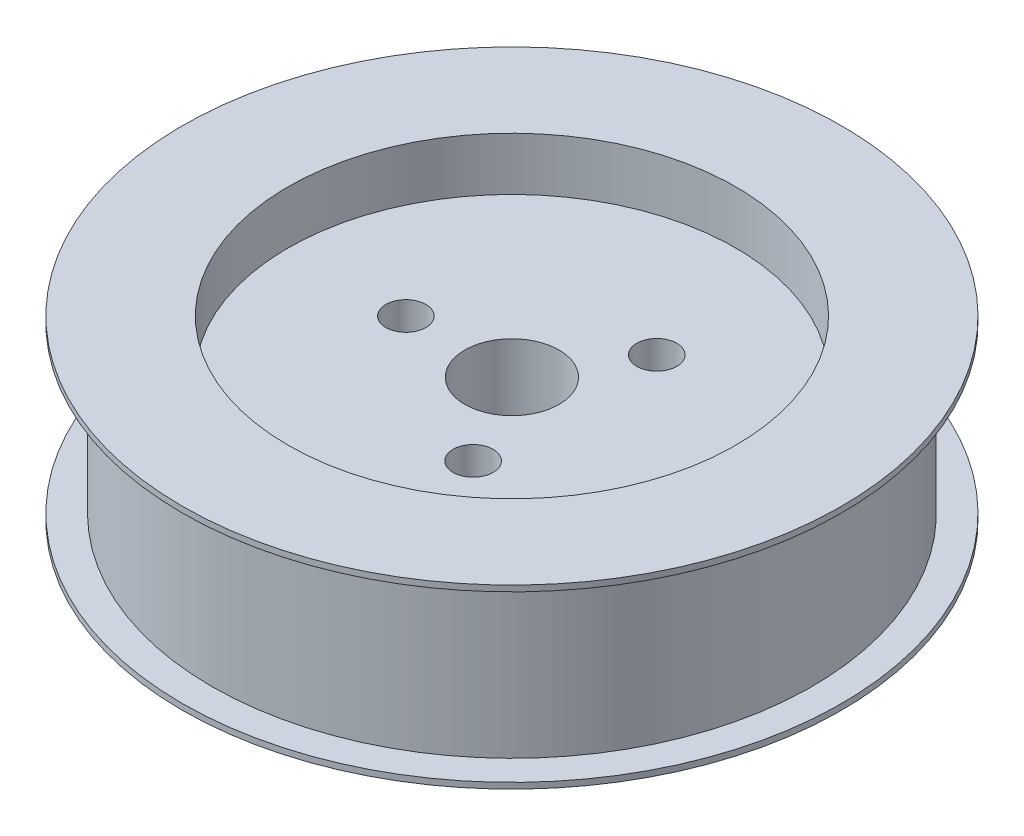
ISO-10303-21;
HEADER;
FILE_DESCRIPTION(('STEP AP214'),'2;1');
FILE_NAME('part.step','',(''),(''),'','','');
FILE_SCHEMA(('AUTOMOTIVE_DESIGN { 1 0 10303 214 1 1 1 1 }'));
ENDSEC;
DATA;
#1=APPLICATION_CONTEXT('core data for automotive mechanical design processes');
#2=APPLICATION_PROTOCOL_DEFINITION('international standard','automotive_design',2000,#1);
#3=PRODUCT_CONTEXT('',#1,'mechanical');
#4=PRODUCT('Part','Part','',(#3));
#5=PRODUCT_RELATED_PRODUCT_CATEGORY('part','',(#4));
#6=PRODUCT_DEFINITION_FORMATION('','',#4);
#7=PRODUCT_DEFINITION_CONTEXT('part definition',#1,'design');
#8=PRODUCT_DEFINITION('design','',#6,#7);
#9=PRODUCT_DEFINITION_SHAPE('','',#8);
#10=(LENGTH_UNIT() NAMED_UNIT(*) SI_UNIT(.MILLI.,.METRE.));
#11=(NAMED_UNIT(*) PLANE_ANGLE_UNIT() SI_UNIT($,.RADIAN.));
#12=(NAMED_UNIT(*) SI_UNIT($,.STERADIAN.) SOLID_ANGLE_UNIT());
#13=UNCERTAINTY_MEASURE_WITH_UNIT(LENGTH_MEASURE(1.E-05),#10,'distance_accuracy_value','');
#14=(GEOMETRIC_REPRESENTATION_CONTEXT(3) GLOBAL_UNCERTAINTY_ASSIGNED_CONTEXT((#13)) GLOBAL_UNIT_ASSIGNED_CONTEXT((#10,
#11,#12)) REPRESENTATION_CONTEXT('',''));
#15=CARTESIAN_POINT('',(0.,0.,0.));
#16=DIRECTION('',(0.,0.,1.));
#17=DIRECTION('',(1.,0.,0.));
#18=AXIS2_PLACEMENT_3D('',#15,#16,#17);
#19=CARTESIAN_POINT('',(0.,-7.5,0.));
#20=DIRECTION('',(0.,1.,0.));
#21=DIRECTION('',(0.,0.,1.));
#22=AXIS2_PLACEMENT_3D('',#19,#20,#21);
#23=CYLINDRICAL_SURFACE('',#22,4.);
#24=CARTESIAN_POINT('',(0.,-3.,0.));
#25=DIRECTION('',(0.,1.,0.));
#26=DIRECTION('',(0.,0.,1.));
#27=AXIS2_PLACEMENT_3D('',#24,#25,#26);
#28=CIRCLE('',#27,4.);
#29=CARTESIAN_POINT('',(0.,-3.,4.));
#30=VERTEX_POINT('',#29);
#31=EDGE_CURVE('E68',#30,#30,#28,.F.);
#32=ORIENTED_EDGE('',*,*,#31,.T.);
#33=EDGE_LOOP('',(#32));
#34=FACE_BOUND('',#33,.T.);
#35=CARTESIAN_POINT('',(0.,3.,0.));
#36=DIRECTION('',(0.,1.,0.));
#37=DIRECTION('',(0.,0.,1.));
#38=AXIS2_PLACEMENT_3D('',#35,#36,#37);
#39=CIRCLE('',#38,4.);
#40=CARTESIAN_POINT('',(0.,3.,4.));
#41=VERTEX_POINT('',#40);
#42=EDGE_CURVE('E60',#41,#41,#39,.F.);
#43=ORIENTED_EDGE('',*,*,#42,.F.);
#44=EDGE_LOOP('',(#43));
#45=FACE_BOUND('',#44,.T.);
#46=ADVANCED_FACE('F39',(#34,#45),#23,.F.);
#47=CARTESIAN_POINT('',(0.,7.5,0.));
#48=DIRECTION('',(0.,-1.,0.));
#49=DIRECTION('',(0.,0.,-1.));
#50=AXIS2_PLACEMENT_3D('',#47,#48,#49);
#51=CYLINDRICAL_SURFACE('',#50,25.47);
#52=CARTESIAN_POINT('',(0.,-7.,0.));
#53=DIRECTION('',(0.,1.,0.));
#54=DIRECTION('',(0.,0.,1.));
#55=AXIS2_PLACEMENT_3D('',#52,#53,#54);
#56=CIRCLE('',#55,25.47);
#57=CARTESIAN_POINT('',(0.,-7.,25.47));
#58=VERTEX_POINT('',#57);
#59=EDGE_CURVE('E56',#58,#58,#56,.T.);
#60=ORIENTED_EDGE('',*,*,#59,.T.);
#61=EDGE_LOOP('',(#60));
#62=FACE_BOUND('',#61,.T.);
#63=CARTESIAN_POINT('',(0.,7.,0.));
#64=DIRECTION('',(0.,1.,0.));
#65=DIRECTION('',(0.,0.,1.));
#66=AXIS2_PLACEMENT_3D('',#63,#64,#65);
#67=CIRCLE('',#66,25.47);
#68=CARTESIAN_POINT('',(0.,7.,25.47));
#69=VERTEX_POINT('',#68);
#70=EDGE_CURVE('E11',#69,#69,#67,.T.);
#71=ORIENTED_EDGE('',*,*,#70,.F.);
#72=EDGE_LOOP('',(#71));
#73=FACE_BOUND('',#72,.T.);
#74=ADVANCED_FACE('F41',(#62,#73),#51,.T.);
#75=CARTESIAN_POINT('',(0.,7.,0.));
#76=DIRECTION('',(0.,1.,0.));
#77=DIRECTION('',(0.,0.,1.));
#78=AXIS2_PLACEMENT_3D('',#75,#76,#77);
#79=CYLINDRICAL_SURFACE('',#78,27.97);
#80=CARTESIAN_POINT('',(0.,7.,0.));
#81=DIRECTION('',(0.,1.,0.));
#82=DIRECTION('',(0.,0.,1.));
#83=AXIS2_PLACEMENT_3D('',#80,#81,#82);
#84=CIRCLE('',#83,27.97);
#85=CARTESIAN_POINT('',(0.,7.,27.97));
#86=VERTEX_POINT('',#85);
#87=EDGE_CURVE('E47',#86,#86,#84,.T.);
#88=ORIENTED_EDGE('',*,*,#87,.T.);
#89=EDGE_LOOP('',(#88));
#90=FACE_BOUND('',#89,.T.);
#91=CARTESIAN_POINT('',(0.,7.5,0.));
#92=DIRECTION('',(0.,1.,0.));
#93=DIRECTION('',(0.,0.,1.));
#94=AXIS2_PLACEMENT_3D('',#91,#92,#93);
#95=CIRCLE('',#94,27.97);
#96=CARTESIAN_POINT('',(0.,7.5,27.97));
#97=VERTEX_POINT('',#96);
#98=EDGE_CURVE('E52',#97,#97,#95,.T.);
#99=ORIENTED_EDGE('',*,*,#98,.F.);
#100=EDGE_LOOP('',(#99));
#101=FACE_BOUND('',#100,.T.);
#102=ADVANCED_FACE('F129',(#90,#101),#79,.T.);
#103=CARTESIAN_POINT('',(0.,7.,0.));
#104=DIRECTION('',(0.,1.,0.));
#105=DIRECTION('',(0.,0.,1.));
#106=AXIS2_PLACEMENT_3D('',#103,#104,#105);
#107=PLANE('',#106);
#108=ORIENTED_EDGE('',*,*,#70,.T.);
#109=EDGE_LOOP('',(#108));
#110=FACE_BOUND('',#109,.T.);
#111=ORIENTED_EDGE('',*,*,#87,.F.);
#112=EDGE_LOOP('',(#111));
#113=FACE_BOUND('',#112,.T.);
#114=ADVANCED_FACE('F138',(#110,#113),#107,.F.);
#115=CARTESIAN_POINT('',(0.,7.5,0.));
#116=DIRECTION('',(0.,1.,0.));
#117=DIRECTION('',(0.,0.,1.));
#118=AXIS2_PLACEMENT_3D('',#115,#116,#117);
#119=PLANE('',#118);
#120=CARTESIAN_POINT('',(0.,7.5,0.));
#121=DIRECTION('',(0.,1.,0.));
#122=DIRECTION('',(0.,0.,1.));
#123=AXIS2_PLACEMENT_3D('',#120,#121,#122);
#124=CIRCLE('',#123,19.);
#125=CARTESIAN_POINT('',(0.,7.5,19.));
#126=VERTEX_POINT('',#125);
#127=EDGE_CURVE('E63',#126,#126,#124,.T.);
#128=ORIENTED_EDGE('',*,*,#127,.F.);
#129=EDGE_LOOP('',(#128));
#130=FACE_BOUND('',#129,.T.);
#131=ORIENTED_EDGE('',*,*,#98,.T.);
#132=EDGE_LOOP('',(#131));
#133=FACE_BOUND('',#132,.T.);
#134=ADVANCED_FACE('F136',(#130,#133),#119,.T.);
#135=CARTESIAN_POINT('',(0.,-7.,0.));
#136=DIRECTION('',(0.,-1.,0.));
#137=DIRECTION('',(0.,0.,-1.));
#138=AXIS2_PLACEMENT_3D('',#135,#136,#137);
#139=CYLINDRICAL_SURFACE('',#138,27.97);
#140=CARTESIAN_POINT('',(0.,-7.,0.));
#141=DIRECTION('',(0.,1.,0.));
#142=DIRECTION('',(0.,0.,1.));
#143=AXIS2_PLACEMENT_3D('',#140,#141,#142);
#144=CIRCLE('',#143,27.97);
#145=CARTESIAN_POINT('',(0.,-7.,27.97));
#146=VERTEX_POINT('',#145);
#147=EDGE_CURVE('E59',#146,#146,#144,.T.);
#148=ORIENTED_EDGE('',*,*,#147,.F.);
#149=EDGE_LOOP('',(#148));
#150=FACE_BOUND('',#149,.T.);
#151=CARTESIAN_POINT('',(0.,-7.5,0.));
#152=DIRECTION('',(0.,1.,0.));
#153=DIRECTION('',(0.,0.,1.));
#154=AXIS2_PLACEMENT_3D('',#151,#152,#153);
#155=CIRCLE('',#154,27.97);
#156=CARTESIAN_POINT('',(0.,-7.5,27.97));
#157=VERTEX_POINT('',#156);
#158=EDGE_CURVE('E97',#157,#157,#155,.T.);
#159=ORIENTED_EDGE('',*,*,#158,.T.);
#160=EDGE_LOOP('',(#159));
#161=FACE_BOUND('',#160,.T.);
#162=ADVANCED_FACE('F103',(#150,#161),#139,.T.);
#163=CARTESIAN_POINT('',(0.,-7.,0.));
#164=DIRECTION('',(0.,1.,0.));
#165=DIRECTION('',(0.,0.,1.));
#166=AXIS2_PLACEMENT_3D('',#163,#164,#165);
#167=PLANE('',#166);
#168=ORIENTED_EDGE('',*,*,#59,.F.);
#169=EDGE_LOOP('',(#168));
#170=FACE_BOUND('',#169,.T.);
#171=ORIENTED_EDGE('',*,*,#147,.T.);
#172=EDGE_LOOP('',(#171));
#173=FACE_BOUND('',#172,.T.);
#174=ADVANCED_FACE('F108',(#170,#173),#167,.T.);
#175=CARTESIAN_POINT('',(0.,-7.5,0.));
#176=DIRECTION('',(0.,1.,0.));
#177=DIRECTION('',(0.,0.,1.));
#178=AXIS2_PLACEMENT_3D('',#175,#176,#177);
#179=PLANE('',#178);
#180=CARTESIAN_POINT('',(0.,-7.5,0.));
#181=DIRECTION('',(0.,1.,0.));
#182=DIRECTION('',(0.,0.,1.));
#183=AXIS2_PLACEMENT_3D('',#180,#181,#182);
#184=CIRCLE('',#183,19.);
#185=CARTESIAN_POINT('',(0.,-7.5,19.));
#186=VERTEX_POINT('',#185);
#187=EDGE_CURVE('E65',#186,#186,#184,.F.);
#188=ORIENTED_EDGE('',*,*,#187,.F.);
#189=EDGE_LOOP('',(#188));
#190=FACE_BOUND('',#189,.T.);
#191=ORIENTED_EDGE('',*,*,#158,.F.);
#192=EDGE_LOOP('',(#191));
#193=FACE_BOUND('',#192,.T.);
#194=ADVANCED_FACE('F105',(#190,#193),#179,.F.);
#195=CARTESIAN_POINT('',(0.,3.,0.));
#196=DIRECTION('',(0.,1.,0.));
#197=DIRECTION('',(0.,0.,1.));
#198=AXIS2_PLACEMENT_3D('',#195,#196,#197);
#199=PLANE('',#198);
#200=CARTESIAN_POINT('',(-9.,3.,0.));
#201=DIRECTION('',(0.,1.,0.));
#202=DIRECTION('',(0.,0.,1.));
#203=AXIS2_PLACEMENT_3D('',#200,#201,#202);
#204=CIRCLE('',#203,1.69999999999999);
#205=CARTESIAN_POINT('',(-9.,3.,1.7));
#206=VERTEX_POINT('',#205);
#207=EDGE_CURVE('E43',#206,#206,#204,.T.);
#208=ORIENTED_EDGE('',*,*,#207,.F.);
#209=EDGE_LOOP('',(#208));
#210=FACE_BOUND('',#209,.T.);
#211=CARTESIAN_POINT('',(4.49999999999999,3.,-7.79422863405995));
#212=DIRECTION('',(0.,1.,0.));
#213=DIRECTION('',(0.,0.,1.));
#214=AXIS2_PLACEMENT_3D('',#211,#212,#213);
#215=CIRCLE('',#214,1.69999999999999);
#216=CARTESIAN_POINT('',(4.49999999999999,3.,-6.09422863405996));
#217=VERTEX_POINT('',#216);
#218=EDGE_CURVE('E75',#217,#217,#215,.T.);
#219=ORIENTED_EDGE('',*,*,#218,.F.);
#220=EDGE_LOOP('',(#219));
#221=FACE_BOUND('',#220,.T.);
#222=CARTESIAN_POINT('',(4.5,3.,7.79422863405995));
#223=DIRECTION('',(0.,1.,0.));
#224=DIRECTION('',(0.,0.,1.));
#225=AXIS2_PLACEMENT_3D('',#222,#223,#224);
#226=CIRCLE('',#225,1.69999999999999);
#227=CARTESIAN_POINT('',(4.5,3.,9.49422863405994));
#228=VERTEX_POINT('',#227);
#229=EDGE_CURVE('E74',#228,#228,#226,.T.);
#230=ORIENTED_EDGE('',*,*,#229,.F.);
#231=EDGE_LOOP('',(#230));
#232=FACE_BOUND('',#231,.T.);
#233=CARTESIAN_POINT('',(0.,3.,0.));
#234=DIRECTION('',(0.,1.,0.));
#235=DIRECTION('',(0.,0.,1.));
#236=AXIS2_PLACEMENT_3D('',#233,#234,#235);
#237=CIRCLE('',#236,19.);
#238=CARTESIAN_POINT('',(0.,3.,19.));
#239=VERTEX_POINT('',#238);
#240=EDGE_CURVE('E64',#239,#239,#237,.F.);
#241=ORIENTED_EDGE('',*,*,#240,.F.);
#242=EDGE_LOOP('',(#241));
#243=FACE_BOUND('',#242,.T.);
#244=ORIENTED_EDGE('',*,*,#42,.T.);
#245=EDGE_LOOP('',(#244));
#246=FACE_BOUND('',#245,.T.);
#247=ADVANCED_FACE('F107',(#210,#221,#232,#243,#246),#199,.T.);
#248=CARTESIAN_POINT('',(0.,-53.7401153701776,0.));
#249=DIRECTION('',(0.,1.,0.));
#250=DIRECTION('',(0.,0.,1.));
#251=AXIS2_PLACEMENT_3D('',#248,#249,#250);
#252=CYLINDRICAL_SURFACE('',#251,19.);
#253=ORIENTED_EDGE('',*,*,#127,.T.);
#254=EDGE_LOOP('',(#253));
#255=FACE_BOUND('',#254,.T.);
#256=ORIENTED_EDGE('',*,*,#240,.T.);
#257=EDGE_LOOP('',(#256));
#258=FACE_BOUND('',#257,.T.);
#259=ADVANCED_FACE('F115',(#255,#258),#252,.F.);
#260=CARTESIAN_POINT('',(0.,-3.,0.));
#261=DIRECTION('',(0.,1.,0.));
#262=DIRECTION('',(0.,0.,1.));
#263=AXIS2_PLACEMENT_3D('',#260,#261,#262);
#264=PLANE('',#263);
#265=CARTESIAN_POINT('',(-9.,-3.,0.));
#266=DIRECTION('',(0.,1.,0.));
#267=DIRECTION('',(0.,0.,1.));
#268=AXIS2_PLACEMENT_3D('',#265,#266,#267);
#269=CIRCLE('',#268,1.69999999999999);
#270=CARTESIAN_POINT('',(-9.,-3.,1.7));
#271=VERTEX_POINT('',#270);
#272=EDGE_CURVE('E78',#271,#271,#269,.T.);
#273=ORIENTED_EDGE('',*,*,#272,.T.);
#274=EDGE_LOOP('',(#273));
#275=FACE_BOUND('',#274,.T.);
#276=CARTESIAN_POINT('',(4.49999999999999,-3.,-7.79422863405995));
#277=DIRECTION('',(0.,1.,0.));
#278=DIRECTION('',(0.,0.,1.));
#279=AXIS2_PLACEMENT_3D('',#276,#277,#278);
#280=CIRCLE('',#279,1.69999999999999);
#281=CARTESIAN_POINT('',(4.49999999999999,-3.,-6.09422863405996));
#282=VERTEX_POINT('',#281);
#283=EDGE_CURVE('E76',#282,#282,#280,.T.);
#284=ORIENTED_EDGE('',*,*,#283,.T.);
#285=EDGE_LOOP('',(#284));
#286=FACE_BOUND('',#285,.T.);
#287=CARTESIAN_POINT('',(4.5,-3.,7.79422863405995));
#288=DIRECTION('',(0.,1.,0.));
#289=DIRECTION('',(0.,0.,1.));
#290=AXIS2_PLACEMENT_3D('',#287,#288,#289);
#291=CIRCLE('',#290,1.69999999999999);
#292=CARTESIAN_POINT('',(4.5,-3.,9.49422863405994));
#293=VERTEX_POINT('',#292);
#294=EDGE_CURVE('E72',#293,#293,#291,.T.);
#295=ORIENTED_EDGE('',*,*,#294,.T.);
#296=EDGE_LOOP('',(#295));
#297=FACE_BOUND('',#296,.T.);
#298=CARTESIAN_POINT('',(0.,-3.,0.));
#299=DIRECTION('',(0.,1.,0.));
#300=DIRECTION('',(0.,0.,1.));
#301=AXIS2_PLACEMENT_3D('',#298,#299,#300);
#302=CIRCLE('',#301,19.);
#303=CARTESIAN_POINT('',(0.,-3.,19.));
#304=VERTEX_POINT('',#303);
#305=EDGE_CURVE('E69',#304,#304,#302,.T.);
#306=ORIENTED_EDGE('',*,*,#305,.F.);
#307=EDGE_LOOP('',(#306));
#308=FACE_BOUND('',#307,.T.);
#309=ORIENTED_EDGE('',*,*,#31,.F.);
#310=EDGE_LOOP('',(#309));
#311=FACE_BOUND('',#310,.T.);
#312=ADVANCED_FACE('F154',(#275,#286,#297,#308,#311),#264,.F.);
#313=CARTESIAN_POINT('',(0.,53.7401153701776,0.));
#314=DIRECTION('',(0.,-1.,0.));
#315=DIRECTION('',(0.,0.,-1.));
#316=AXIS2_PLACEMENT_3D('',#313,#314,#315);
#317=CYLINDRICAL_SURFACE('',#316,19.);
#318=ORIENTED_EDGE('',*,*,#305,.T.);
#319=EDGE_LOOP('',(#318));
#320=FACE_BOUND('',#319,.T.);
#321=ORIENTED_EDGE('',*,*,#187,.T.);
#322=EDGE_LOOP('',(#321));
#323=FACE_BOUND('',#322,.T.);
#324=ADVANCED_FACE('F162',(#320,#323),#317,.F.);
#325=CARTESIAN_POINT('',(4.5,7.5,7.79422863405995));
#326=DIRECTION('',(0.,1.,0.));
#327=DIRECTION('',(0.,0.,1.));
#328=AXIS2_PLACEMENT_3D('',#325,#326,#327);
#329=CYLINDRICAL_SURFACE('',#328,1.69999999999999);
#330=ORIENTED_EDGE('',*,*,#229,.T.);
#331=EDGE_LOOP('',(#330));
#332=FACE_BOUND('',#331,.T.);
#333=ORIENTED_EDGE('',*,*,#294,.F.);
#334=EDGE_LOOP('',(#333));
#335=FACE_BOUND('',#334,.T.);
#336=ADVANCED_FACE('F167',(#332,#335),#329,.F.);
#337=CARTESIAN_POINT('',(4.49999999999999,7.5,-7.79422863405995));
#338=DIRECTION('',(0.,1.,0.));
#339=DIRECTION('',(0.,0.,1.));
#340=AXIS2_PLACEMENT_3D('',#337,#338,#339);
#341=CYLINDRICAL_SURFACE('',#340,1.69999999999999);
#342=ORIENTED_EDGE('',*,*,#218,.T.);
#343=EDGE_LOOP('',(#342));
#344=FACE_BOUND('',#343,.T.);
#345=ORIENTED_EDGE('',*,*,#283,.F.);
#346=EDGE_LOOP('',(#345));
#347=FACE_BOUND('',#346,.T.);
#348=ADVANCED_FACE('F172',(#344,#347),#341,.F.);
#349=CARTESIAN_POINT('',(-9.,7.5,0.));
#350=DIRECTION('',(0.,1.,0.));
#351=DIRECTION('',(0.,0.,1.));
#352=AXIS2_PLACEMENT_3D('',#349,#350,#351);
#353=CYLINDRICAL_SURFACE('',#352,1.69999999999999);
#354=ORIENTED_EDGE('',*,*,#207,.T.);
#355=EDGE_LOOP('',(#354));
#356=FACE_BOUND('',#355,.T.);
#357=ORIENTED_EDGE('',*,*,#272,.F.);
#358=EDGE_LOOP('',(#357));
#359=FACE_BOUND('',#358,.T.);
#360=ADVANCED_FACE('F176',(#356,#359),#353,.F.);
#361=CLOSED_SHELL('',(#46,#74,#102,#114,#134,#162,#174,#194,#247,#259,#312,#324,#336,#348,#360));
#362=MANIFOLD_SOLID_BREP('B2',#361);
#363=ADVANCED_BREP_SHAPE_REPRESENTATION('',(#18,#362),#14);
#364=SHAPE_DEFINITION_REPRESENTATION(#9,#363);
ENDSEC;
END-ISO-10303-21;
